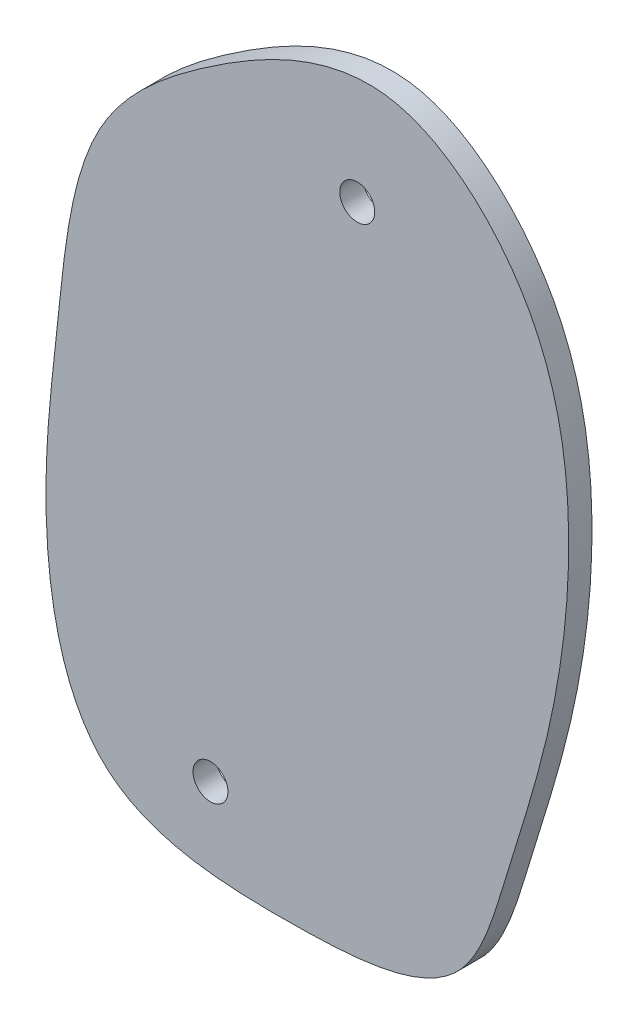
ISO-10303-21;
HEADER;
FILE_DESCRIPTION(('STEP AP214'),'2;1');
FILE_NAME('part.step','',(''),(''),'','','');
FILE_SCHEMA(('AUTOMOTIVE_DESIGN { 1 0 10303 214 1 1 1 1 }'));
ENDSEC;
DATA;
#1=APPLICATION_CONTEXT('core data for automotive mechanical design processes');
#2=APPLICATION_PROTOCOL_DEFINITION('international standard','automotive_design',2000,#1);
#3=PRODUCT_CONTEXT('',#1,'mechanical');
#4=PRODUCT('Part','Part','',(#3));
#5=PRODUCT_RELATED_PRODUCT_CATEGORY('part','',(#4));
#6=PRODUCT_DEFINITION_FORMATION('','',#4);
#7=PRODUCT_DEFINITION_CONTEXT('part definition',#1,'design');
#8=PRODUCT_DEFINITION('design','',#6,#7);
#9=PRODUCT_DEFINITION_SHAPE('','',#8);
#10=(LENGTH_UNIT() NAMED_UNIT(*) SI_UNIT(.MILLI.,.METRE.));
#11=(NAMED_UNIT(*) PLANE_ANGLE_UNIT() SI_UNIT($,.RADIAN.));
#12=(NAMED_UNIT(*) SI_UNIT($,.STERADIAN.) SOLID_ANGLE_UNIT());
#13=UNCERTAINTY_MEASURE_WITH_UNIT(LENGTH_MEASURE(1.E-05),#10,'distance_accuracy_value','');
#14=(GEOMETRIC_REPRESENTATION_CONTEXT(3) GLOBAL_UNCERTAINTY_ASSIGNED_CONTEXT((#13)) GLOBAL_UNIT_ASSIGNED_CONTEXT((#10,
#11,#12)) REPRESENTATION_CONTEXT('',''));
#15=CARTESIAN_POINT('',(0.,0.,0.));
#16=DIRECTION('',(0.,0.,1.));
#17=DIRECTION('',(1.,0.,0.));
#18=AXIS2_PLACEMENT_3D('',#15,#16,#17);
#19=CARTESIAN_POINT('',(307.136372953782,222.966876495801,3.73350664295911));
#20=DIRECTION('',(0.,0.,1.));
#21=DIRECTION('',(1.,0.,0.));
#22=AXIS2_PLACEMENT_3D('',#19,#20,#21);
#23=PLANE('',#22);
#24=CARTESIAN_POINT('',(258.309775820419,169.28576958756,3.73350664295911));
#25=DIRECTION('',(0.,0.,1.));
#26=DIRECTION('',(1.,0.,0.));
#27=AXIS2_PLACEMENT_3D('',#24,#25,#26);
#28=CIRCLE('',#27,2.38125);
#29=CARTESIAN_POINT('',(260.691025820419,169.28576958756,3.73350664295911));
#30=VERTEX_POINT('',#29);
#31=EDGE_CURVE('E61',#30,#30,#28,.T.);
#32=ORIENTED_EDGE('',*,*,#31,.F.);
#33=EDGE_LOOP('',(#32));
#34=FACE_BOUND('',#33,.T.);
#35=CARTESIAN_POINT('',(278.31846642685,247.719836764771,3.73350664295911));
#36=DIRECTION('',(0.,0.,1.));
#37=DIRECTION('',(1.,0.,0.));
#38=AXIS2_PLACEMENT_3D('',#35,#36,#37);
#39=CIRCLE('',#38,2.38125);
#40=CARTESIAN_POINT('',(280.69971642685,247.719836764771,3.73350664295911));
#41=VERTEX_POINT('',#40);
#42=EDGE_CURVE('E52',#41,#41,#39,.T.);
#43=ORIENTED_EDGE('',*,*,#42,.F.);
#44=EDGE_LOOP('',(#43));
#45=FACE_BOUND('',#44,.T.);
#46=CARTESIAN_POINT('',(235.900042341215,193.696372127407,3.73350664295911));
#47=CARTESIAN_POINT('',(235.727165420628,182.751314279085,3.73350664295911));
#48=CARTESIAN_POINT('',(238.562783450473,159.074147449765,3.73350664295911));
#49=CARTESIAN_POINT('',(268.709039997233,157.489782326358,3.73350664295911));
#50=CARTESIAN_POINT('',(292.976741994732,159.222327052177,3.73350664295911));
#51=CARTESIAN_POINT('',(298.905963080785,179.488616154263,3.73350664295911));
#52=CARTESIAN_POINT('',(305.089709987386,198.395022050001,3.73350664295911));
#53=CARTESIAN_POINT('',(308.469336152115,222.703125725924,3.73350664295911));
#54=CARTESIAN_POINT('',(304.324997535573,247.921348887833,3.73350664295911));
#55=CARTESIAN_POINT('',(282.735382703735,267.774140289,3.73350664295911));
#56=CARTESIAN_POINT('',(259.05027453055,255.273792831341,3.73350664295911));
#57=CARTESIAN_POINT('',(239.835302580017,239.304529920004,3.73350664295911));
#58=CARTESIAN_POINT('',(237.875042699412,215.090281894805,3.73350664295911));
#59=CARTESIAN_POINT('',(236.009167311935,200.605212897842,3.73350664295911));
#60=CARTESIAN_POINT('',(235.900042341215,193.696372127407,3.73350664295911));
#61=B_SPLINE_CURVE_WITH_KNOTS('',3,(#46,#47,#48,#49,#50,#51,#52,#53,#54,#55,#56,#57,#58,#59,
#60),.UNSPECIFIED.,.T.,.F.,(4,1,1,1,1,1,1,1,1,1,1,1,4),(0.,0.109929190596168,0.202397237356621,
0.284224134574093,0.335387547845201,0.405959451352142,0.501197535960332,0.58986011658121,
0.671198636430082,0.763591247442611,0.836454815430022,0.930609478325577,1.),.UNSPECIFIED.);
#62=CARTESIAN_POINT('',(235.900042341215,193.696372127407,3.73350664295911));
#63=VERTEX_POINT('',#62);
#64=EDGE_CURVE('E10',#63,#63,#61,.T.);
#65=ORIENTED_EDGE('',*,*,#64,.T.);
#66=EDGE_LOOP('',(#65));
#67=FACE_BOUND('',#66,.T.);
#68=ADVANCED_FACE('F34',(#34,#45,#67),#23,.T.);
#69=CARTESIAN_POINT('',(307.136372953782,222.966876495801,0.558506643317017));
#70=DIRECTION('',(0.,0.,1.));
#71=DIRECTION('',(1.,0.,0.));
#72=AXIS2_PLACEMENT_3D('',#69,#70,#71);
#73=PLANE('',#72);
#74=CARTESIAN_POINT('',(258.309775820419,169.28576958756,0.558506643317017));
#75=DIRECTION('',(0.,0.,1.));
#76=DIRECTION('',(1.,0.,0.));
#77=AXIS2_PLACEMENT_3D('',#74,#75,#76);
#78=CIRCLE('',#77,2.38125);
#79=CARTESIAN_POINT('',(260.691025820419,169.28576958756,0.558506643317017));
#80=VERTEX_POINT('',#79);
#81=EDGE_CURVE('E58',#80,#80,#78,.T.);
#82=ORIENTED_EDGE('',*,*,#81,.T.);
#83=EDGE_LOOP('',(#82));
#84=FACE_BOUND('',#83,.T.);
#85=CARTESIAN_POINT('',(278.31846642685,247.719836764771,0.558506643317017));
#86=DIRECTION('',(0.,0.,1.));
#87=DIRECTION('',(1.,0.,0.));
#88=AXIS2_PLACEMENT_3D('',#85,#86,#87);
#89=CIRCLE('',#88,2.38125);
#90=CARTESIAN_POINT('',(280.69971642685,247.719836764771,0.558506643317017));
#91=VERTEX_POINT('',#90);
#92=EDGE_CURVE('E47',#91,#91,#89,.T.);
#93=ORIENTED_EDGE('',*,*,#92,.T.);
#94=EDGE_LOOP('',(#93));
#95=FACE_BOUND('',#94,.T.);
#96=CARTESIAN_POINT('',(235.900042341215,193.696372127407,0.558506643317017));
#97=CARTESIAN_POINT('',(235.727165420628,182.751314279085,0.558506643317017));
#98=CARTESIAN_POINT('',(238.562783450473,159.074147449765,0.558506643317017));
#99=CARTESIAN_POINT('',(268.709039997233,157.489782326358,0.558506643317017));
#100=CARTESIAN_POINT('',(292.976741994732,159.222327052177,0.558506643317017));
#101=CARTESIAN_POINT('',(298.905963080785,179.488616154263,0.558506643317017));
#102=CARTESIAN_POINT('',(305.089709987386,198.395022050001,0.558506643317017));
#103=CARTESIAN_POINT('',(308.469336152115,222.703125725924,0.558506643317017));
#104=CARTESIAN_POINT('',(304.324997535573,247.921348887833,0.558506643317017));
#105=CARTESIAN_POINT('',(282.735382703735,267.774140289,0.558506643317017));
#106=CARTESIAN_POINT('',(259.05027453055,255.273792831341,0.558506643317017));
#107=CARTESIAN_POINT('',(239.835302580017,239.304529920004,0.558506643317017));
#108=CARTESIAN_POINT('',(237.875042699412,215.090281894805,0.558506643317017));
#109=CARTESIAN_POINT('',(236.009167311935,200.605212897842,0.558506643317017));
#110=CARTESIAN_POINT('',(235.900042341215,193.696372127407,0.558506643317017));
#111=B_SPLINE_CURVE_WITH_KNOTS('',3,(#96,#97,#98,#99,#100,#101,#102,#103,#104,#105,#106,#107,
#108,#109,#110),.UNSPECIFIED.,.T.,.F.,(4,1,1,1,1,1,1,1,1,1,1,1,4),(0.,0.109929190596168,
0.202397237356621,0.284224134574093,0.335387547845201,0.405959451352142,0.501197535960332,
0.58986011658121,0.671198636430082,0.763591247442611,0.836454815430022,0.930609478325577,1.),.UNSPECIFIED.);
#112=CARTESIAN_POINT('',(235.900042341215,193.696372127407,0.558506643317017));
#113=VERTEX_POINT('',#112);
#114=EDGE_CURVE('E39',#113,#113,#111,.T.);
#115=ORIENTED_EDGE('',*,*,#114,.F.);
#116=EDGE_LOOP('',(#115));
#117=FACE_BOUND('',#116,.T.);
#118=ADVANCED_FACE('F67',(#84,#95,#117),#73,.F.);
#119=DIRECTION('',(0.,0.,-1.));
#120=VECTOR('',#119,1.);
#121=SURFACE_OF_LINEAR_EXTRUSION('',#61,#120);
#122=ORIENTED_EDGE('',*,*,#64,.F.);
#123=EDGE_LOOP('',(#122));
#124=FACE_BOUND('',#123,.T.);
#125=ORIENTED_EDGE('',*,*,#114,.T.);
#126=EDGE_LOOP('',(#125));
#127=FACE_BOUND('',#126,.T.);
#128=ADVANCED_FACE('F36',(#124,#127),#121,.F.);
#129=CARTESIAN_POINT('',(278.31846642685,247.719836764771,0.558506643317017));
#130=DIRECTION('',(0.,0.,1.));
#131=DIRECTION('',(1.,0.,0.));
#132=AXIS2_PLACEMENT_3D('',#129,#130,#131);
#133=CYLINDRICAL_SURFACE('',#132,2.38125);
#134=ORIENTED_EDGE('',*,*,#92,.F.);
#135=EDGE_LOOP('',(#134));
#136=FACE_BOUND('',#135,.T.);
#137=ORIENTED_EDGE('',*,*,#42,.T.);
#138=EDGE_LOOP('',(#137));
#139=FACE_BOUND('',#138,.T.);
#140=ADVANCED_FACE('F73',(#136,#139),#133,.F.);
#141=CARTESIAN_POINT('',(258.309775820419,169.28576958756,0.558506643317017));
#142=DIRECTION('',(0.,0.,1.));
#143=DIRECTION('',(1.,0.,0.));
#144=AXIS2_PLACEMENT_3D('',#141,#142,#143);
#145=CYLINDRICAL_SURFACE('',#144,2.38125);
#146=ORIENTED_EDGE('',*,*,#81,.F.);
#147=EDGE_LOOP('',(#146));
#148=FACE_BOUND('',#147,.T.);
#149=ORIENTED_EDGE('',*,*,#31,.T.);
#150=EDGE_LOOP('',(#149));
#151=FACE_BOUND('',#150,.T.);
#152=ADVANCED_FACE('F70',(#148,#151),#145,.F.);
#153=CLOSED_SHELL('',(#68,#118,#128,#140,#152));
#154=MANIFOLD_SOLID_BREP('B2',#153);
#155=ADVANCED_BREP_SHAPE_REPRESENTATION('',(#18,#154),#14);
#156=SHAPE_DEFINITION_REPRESENTATION(#9,#155);
ENDSEC;
END-ISO-10303-21;
